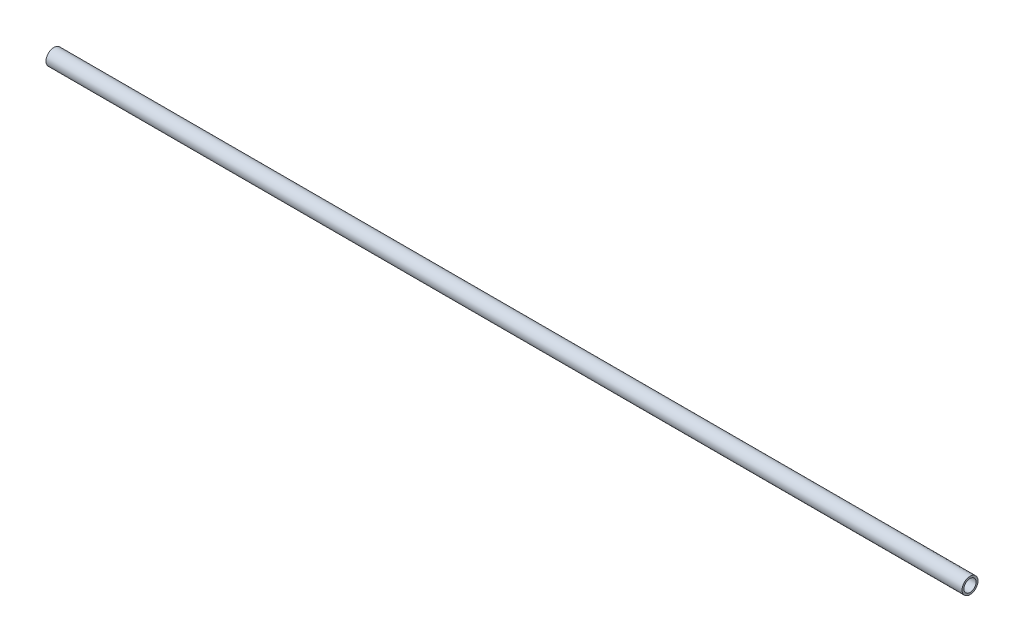
ISO-10303-21;
HEADER;
FILE_DESCRIPTION(('STEP AP214'),'2;1');
FILE_NAME('part.step','',(''),(''),'','','');
FILE_SCHEMA(('AUTOMOTIVE_DESIGN { 1 0 10303 214 1 1 1 1 }'));
ENDSEC;
DATA;
#1=APPLICATION_CONTEXT('core data for automotive mechanical design processes');
#2=APPLICATION_PROTOCOL_DEFINITION('international standard','automotive_design',2000,#1);
#3=PRODUCT_CONTEXT('',#1,'mechanical');
#4=PRODUCT('Part','Part','',(#3));
#5=PRODUCT_RELATED_PRODUCT_CATEGORY('part','',(#4));
#6=PRODUCT_DEFINITION_FORMATION('','',#4);
#7=PRODUCT_DEFINITION_CONTEXT('part definition',#1,'design');
#8=PRODUCT_DEFINITION('design','',#6,#7);
#9=PRODUCT_DEFINITION_SHAPE('','',#8);
#10=(LENGTH_UNIT() NAMED_UNIT(*) SI_UNIT(.MILLI.,.METRE.));
#11=(NAMED_UNIT(*) PLANE_ANGLE_UNIT() SI_UNIT($,.RADIAN.));
#12=(NAMED_UNIT(*) SI_UNIT($,.STERADIAN.) SOLID_ANGLE_UNIT());
#13=UNCERTAINTY_MEASURE_WITH_UNIT(LENGTH_MEASURE(1.E-05),#10,'distance_accuracy_value','');
#14=(GEOMETRIC_REPRESENTATION_CONTEXT(3) GLOBAL_UNCERTAINTY_ASSIGNED_CONTEXT((#13)) GLOBAL_UNIT_ASSIGNED_CONTEXT((#10,
#11,#12)) REPRESENTATION_CONTEXT('',''));
#15=CARTESIAN_POINT('',(0.,0.,0.));
#16=DIRECTION('',(0.,0.,1.));
#17=DIRECTION('',(1.,0.,0.));
#18=AXIS2_PLACEMENT_3D('',#15,#16,#17);
#19=CARTESIAN_POINT('',(1460.5,0.,0.));
#20=DIRECTION('',(1.,0.,0.));
#21=DIRECTION('',(0.,0.,-1.));
#22=AXIS2_PLACEMENT_3D('',#19,#20,#21);
#23=PLANE('',#22);
#24=CARTESIAN_POINT('',(1460.5,0.,0.));
#25=DIRECTION('',(1.,0.,0.));
#26=DIRECTION('',(0.,0.,-1.));
#27=AXIS2_PLACEMENT_3D('',#24,#25,#26);
#28=CIRCLE('',#27,12.7);
#29=CARTESIAN_POINT('',(1460.5,0.,-12.7));
#30=VERTEX_POINT('',#29);
#31=EDGE_CURVE('E10',#30,#30,#28,.T.);
#32=ORIENTED_EDGE('',*,*,#31,.T.);
#33=EDGE_LOOP('',(#32));
#34=FACE_BOUND('',#33,.T.);
#35=CARTESIAN_POINT('',(1460.5,0.,0.));
#36=DIRECTION('',(1.,0.,0.));
#37=DIRECTION('',(0.,0.,-1.));
#38=AXIS2_PLACEMENT_3D('',#35,#36,#37);
#39=CIRCLE('',#38,9.652);
#40=CARTESIAN_POINT('',(1460.5,0.,-9.652));
#41=VERTEX_POINT('',#40);
#42=EDGE_CURVE('E49',#41,#41,#39,.T.);
#43=ORIENTED_EDGE('',*,*,#42,.F.);
#44=EDGE_LOOP('',(#43));
#45=FACE_BOUND('',#44,.T.);
#46=ADVANCED_FACE('F34',(#34,#45),#23,.T.);
#47=CARTESIAN_POINT('',(0.,0.,0.));
#48=DIRECTION('',(1.,0.,0.));
#49=DIRECTION('',(0.,0.,-1.));
#50=AXIS2_PLACEMENT_3D('',#47,#48,#49);
#51=PLANE('',#50);
#52=CARTESIAN_POINT('',(0.,0.,0.));
#53=DIRECTION('',(1.,0.,0.));
#54=DIRECTION('',(0.,0.,-1.));
#55=AXIS2_PLACEMENT_3D('',#52,#53,#54);
#56=CIRCLE('',#55,12.7);
#57=CARTESIAN_POINT('',(0.,0.,-12.7));
#58=VERTEX_POINT('',#57);
#59=EDGE_CURVE('E38',#58,#58,#56,.T.);
#60=ORIENTED_EDGE('',*,*,#59,.F.);
#61=EDGE_LOOP('',(#60));
#62=FACE_BOUND('',#61,.T.);
#63=CARTESIAN_POINT('',(0.,0.,0.));
#64=DIRECTION('',(1.,0.,0.));
#65=DIRECTION('',(0.,0.,-1.));
#66=AXIS2_PLACEMENT_3D('',#63,#64,#65);
#67=CIRCLE('',#66,9.652);
#68=CARTESIAN_POINT('',(0.,0.,-9.652));
#69=VERTEX_POINT('',#68);
#70=EDGE_CURVE('E51',#69,#69,#67,.T.);
#71=ORIENTED_EDGE('',*,*,#70,.T.);
#72=EDGE_LOOP('',(#71));
#73=FACE_BOUND('',#72,.T.);
#74=ADVANCED_FACE('F61',(#62,#73),#51,.F.);
#75=CARTESIAN_POINT('',(1460.5,0.,0.));
#76=DIRECTION('',(-1.,0.,0.));
#77=DIRECTION('',(0.,0.,1.));
#78=AXIS2_PLACEMENT_3D('',#75,#76,#77);
#79=CYLINDRICAL_SURFACE('',#78,12.7);
#80=ORIENTED_EDGE('',*,*,#31,.F.);
#81=EDGE_LOOP('',(#80));
#82=FACE_BOUND('',#81,.T.);
#83=ORIENTED_EDGE('',*,*,#59,.T.);
#84=EDGE_LOOP('',(#83));
#85=FACE_BOUND('',#84,.T.);
#86=ADVANCED_FACE('F36',(#82,#85),#79,.T.);
#87=CARTESIAN_POINT('',(1460.5,0.,0.));
#88=DIRECTION('',(-1.,0.,0.));
#89=DIRECTION('',(0.,0.,1.));
#90=AXIS2_PLACEMENT_3D('',#87,#88,#89);
#91=CYLINDRICAL_SURFACE('',#90,9.652);
#92=ORIENTED_EDGE('',*,*,#42,.T.);
#93=EDGE_LOOP('',(#92));
#94=FACE_BOUND('',#93,.T.);
#95=ORIENTED_EDGE('',*,*,#70,.F.);
#96=EDGE_LOOP('',(#95));
#97=FACE_BOUND('',#96,.T.);
#98=ADVANCED_FACE('F57',(#94,#97),#91,.F.);
#99=CLOSED_SHELL('',(#46,#74,#86,#98));
#100=MANIFOLD_SOLID_BREP('B2',#99);
#101=ADVANCED_BREP_SHAPE_REPRESENTATION('',(#18,#100),#14);
#102=SHAPE_DEFINITION_REPRESENTATION(#9,#101);
ENDSEC;
END-ISO-10303-21;
